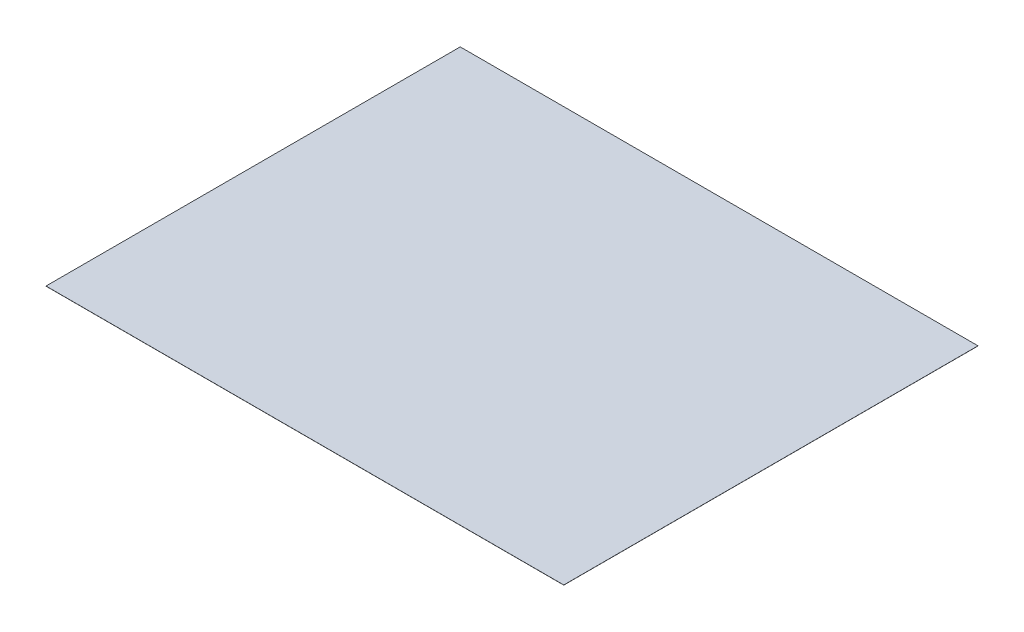
ISO-10303-21;
HEADER;
FILE_DESCRIPTION(('STEP AP214'),'2;1');
FILE_NAME('part.step','',(''),(''),'','','');
FILE_SCHEMA(('AUTOMOTIVE_DESIGN { 1 0 10303 214 1 1 1 1 }'));
ENDSEC;
DATA;
#1=APPLICATION_CONTEXT('core data for automotive mechanical design processes');
#2=APPLICATION_PROTOCOL_DEFINITION('international standard','automotive_design',2000,#1);
#3=PRODUCT_CONTEXT('',#1,'mechanical');
#4=PRODUCT('Part','Part','',(#3));
#5=PRODUCT_RELATED_PRODUCT_CATEGORY('part','',(#4));
#6=PRODUCT_DEFINITION_FORMATION('','',#4);
#7=PRODUCT_DEFINITION_CONTEXT('part definition',#1,'design');
#8=PRODUCT_DEFINITION('design','',#6,#7);
#9=PRODUCT_DEFINITION_SHAPE('','',#8);
#10=(LENGTH_UNIT() NAMED_UNIT(*) SI_UNIT(.MILLI.,.METRE.));
#11=(NAMED_UNIT(*) PLANE_ANGLE_UNIT() SI_UNIT($,.RADIAN.));
#12=(NAMED_UNIT(*) SI_UNIT($,.STERADIAN.) SOLID_ANGLE_UNIT());
#13=UNCERTAINTY_MEASURE_WITH_UNIT(LENGTH_MEASURE(1.E-05),#10,'distance_accuracy_value','');
#14=(GEOMETRIC_REPRESENTATION_CONTEXT(3) GLOBAL_UNCERTAINTY_ASSIGNED_CONTEXT((#13)) GLOBAL_UNIT_ASSIGNED_CONTEXT((#10,
#11,#12)) REPRESENTATION_CONTEXT('',''));
#15=CARTESIAN_POINT('',(0.,0.,0.));
#16=DIRECTION('',(0.,0.,1.));
#17=DIRECTION('',(1.,0.,0.));
#18=AXIS2_PLACEMENT_3D('',#15,#16,#17);
#19=CARTESIAN_POINT('',(3048.,1.5875,2438.4));
#20=DIRECTION('',(-1.,0.,0.));
#21=DIRECTION('',(0.,0.,1.));
#22=AXIS2_PLACEMENT_3D('',#19,#20,#21);
#23=PLANE('',#22);
#24=DIRECTION('',(0.,0.,-1.));
#25=VECTOR('',#24,1.);
#26=CARTESIAN_POINT('',(3048.,0.,2438.4));
#27=LINE('',#26,#25);
#28=CARTESIAN_POINT('',(3048.,0.,2438.4));
#29=VERTEX_POINT('',#28);
#30=CARTESIAN_POINT('',(3048.,0.,-2438.4));
#31=VERTEX_POINT('',#30);
#32=EDGE_CURVE('E102',#29,#31,#27,.T.);
#33=ORIENTED_EDGE('',*,*,#32,.T.);
#34=DIRECTION('',(0.,-1.,0.));
#35=VECTOR('',#34,1.);
#36=CARTESIAN_POINT('',(3048.,1.5875,-2438.4));
#37=LINE('',#36,#35);
#38=CARTESIAN_POINT('',(3048.,1.5875,-2438.4));
#39=VERTEX_POINT('',#38);
#40=EDGE_CURVE('E11',#39,#31,#37,.T.);
#41=ORIENTED_EDGE('',*,*,#40,.F.);
#42=DIRECTION('',(0.,0.,-1.));
#43=VECTOR('',#42,1.);
#44=CARTESIAN_POINT('',(3048.,1.5875,2438.4));
#45=LINE('',#44,#43);
#46=CARTESIAN_POINT('',(3048.,1.5875,2438.4));
#47=VERTEX_POINT('',#46);
#48=EDGE_CURVE('E90',#47,#39,#45,.T.);
#49=ORIENTED_EDGE('',*,*,#48,.F.);
#50=DIRECTION('',(0.,-1.,0.));
#51=VECTOR('',#50,1.);
#52=CARTESIAN_POINT('',(3048.,1.5875,2438.4));
#53=LINE('',#52,#51);
#54=EDGE_CURVE('E98',#47,#29,#53,.T.);
#55=ORIENTED_EDGE('',*,*,#54,.T.);
#56=EDGE_LOOP('',(#33,#41,#49,#55));
#57=FACE_BOUND('',#56,.T.);
#58=ADVANCED_FACE('F39',(#57),#23,.F.);
#59=CARTESIAN_POINT('',(-3048.,1.5875,-2438.4));
#60=DIRECTION('',(0.,0.,1.));
#61=DIRECTION('',(1.,0.,0.));
#62=AXIS2_PLACEMENT_3D('',#59,#60,#61);
#63=PLANE('',#62);
#64=DIRECTION('',(-1.,0.,0.));
#65=VECTOR('',#64,1.);
#66=CARTESIAN_POINT('',(-3048.,0.,-2438.4));
#67=LINE('',#66,#65);
#68=CARTESIAN_POINT('',(-3048.,0.,-2438.4));
#69=VERTEX_POINT('',#68);
#70=EDGE_CURVE('E94',#31,#69,#67,.T.);
#71=ORIENTED_EDGE('',*,*,#70,.T.);
#72=DIRECTION('',(0.,-1.,0.));
#73=VECTOR('',#72,1.);
#74=CARTESIAN_POINT('',(-3048.,1.5875,-2438.4));
#75=LINE('',#74,#73);
#76=CARTESIAN_POINT('',(-3048.,1.5875,-2438.4));
#77=VERTEX_POINT('',#76);
#78=EDGE_CURVE('E47',#77,#69,#75,.T.);
#79=ORIENTED_EDGE('',*,*,#78,.F.);
#80=DIRECTION('',(-1.,0.,0.));
#81=VECTOR('',#80,1.);
#82=CARTESIAN_POINT('',(-3048.,1.5875,-2438.4));
#83=LINE('',#82,#81);
#84=EDGE_CURVE('E85',#39,#77,#83,.T.);
#85=ORIENTED_EDGE('',*,*,#84,.F.);
#86=ORIENTED_EDGE('',*,*,#40,.T.);
#87=EDGE_LOOP('',(#71,#79,#85,#86));
#88=FACE_BOUND('',#87,.T.);
#89=ADVANCED_FACE('F93',(#88),#63,.F.);
#90=CARTESIAN_POINT('',(-3048.,1.5875,2438.4));
#91=DIRECTION('',(1.,0.,0.));
#92=DIRECTION('',(0.,0.,-1.));
#93=AXIS2_PLACEMENT_3D('',#90,#91,#92);
#94=PLANE('',#93);
#95=DIRECTION('',(0.,0.,1.));
#96=VECTOR('',#95,1.);
#97=CARTESIAN_POINT('',(-3048.,0.,2438.4));
#98=LINE('',#97,#96);
#99=CARTESIAN_POINT('',(-3048.,0.,2438.4));
#100=VERTEX_POINT('',#99);
#101=EDGE_CURVE('E72',#69,#100,#98,.T.);
#102=ORIENTED_EDGE('',*,*,#101,.T.);
#103=DIRECTION('',(0.,-1.,0.));
#104=VECTOR('',#103,1.);
#105=CARTESIAN_POINT('',(-3048.,1.5875,2438.4));
#106=LINE('',#105,#104);
#107=CARTESIAN_POINT('',(-3048.,1.5875,2438.4));
#108=VERTEX_POINT('',#107);
#109=EDGE_CURVE('E95',#108,#100,#106,.T.);
#110=ORIENTED_EDGE('',*,*,#109,.F.);
#111=DIRECTION('',(0.,0.,1.));
#112=VECTOR('',#111,1.);
#113=CARTESIAN_POINT('',(-3048.,1.5875,2438.4));
#114=LINE('',#113,#112);
#115=EDGE_CURVE('E88',#77,#108,#114,.T.);
#116=ORIENTED_EDGE('',*,*,#115,.F.);
#117=ORIENTED_EDGE('',*,*,#78,.T.);
#118=EDGE_LOOP('',(#102,#110,#116,#117));
#119=FACE_BOUND('',#118,.T.);
#120=ADVANCED_FACE('F96',(#119),#94,.F.);
#121=CARTESIAN_POINT('',(-3048.,1.5875,2438.4));
#122=DIRECTION('',(0.,0.,-1.));
#123=DIRECTION('',(-1.,0.,0.));
#124=AXIS2_PLACEMENT_3D('',#121,#122,#123);
#125=PLANE('',#124);
#126=DIRECTION('',(1.,0.,0.));
#127=VECTOR('',#126,1.);
#128=CARTESIAN_POINT('',(-3048.,0.,2438.4));
#129=LINE('',#128,#127);
#130=EDGE_CURVE('E78',#100,#29,#129,.T.);
#131=ORIENTED_EDGE('',*,*,#130,.T.);
#132=ORIENTED_EDGE('',*,*,#54,.F.);
#133=DIRECTION('',(1.,0.,0.));
#134=VECTOR('',#133,1.);
#135=CARTESIAN_POINT('',(-3048.,1.5875,2438.4));
#136=LINE('',#135,#134);
#137=EDGE_CURVE('E55',#108,#47,#136,.T.);
#138=ORIENTED_EDGE('',*,*,#137,.F.);
#139=ORIENTED_EDGE('',*,*,#109,.T.);
#140=EDGE_LOOP('',(#131,#132,#138,#139));
#141=FACE_BOUND('',#140,.T.);
#142=ADVANCED_FACE('F109',(#141),#125,.F.);
#143=CARTESIAN_POINT('',(0.,1.5875,0.));
#144=DIRECTION('',(0.,-1.,0.));
#145=DIRECTION('',(0.,0.,-1.));
#146=AXIS2_PLACEMENT_3D('',#143,#144,#145);
#147=PLANE('',#146);
#148=ORIENTED_EDGE('',*,*,#48,.T.);
#149=ORIENTED_EDGE('',*,*,#84,.T.);
#150=ORIENTED_EDGE('',*,*,#115,.T.);
#151=ORIENTED_EDGE('',*,*,#137,.T.);
#152=EDGE_LOOP('',(#148,#149,#150,#151));
#153=FACE_BOUND('',#152,.T.);
#154=ADVANCED_FACE('F86',(#153),#147,.F.);
#155=CARTESIAN_POINT('',(0.,0.,0.));
#156=DIRECTION('',(0.,-1.,0.));
#157=DIRECTION('',(0.,0.,-1.));
#158=AXIS2_PLACEMENT_3D('',#155,#156,#157);
#159=PLANE('',#158);
#160=ORIENTED_EDGE('',*,*,#32,.F.);
#161=ORIENTED_EDGE('',*,*,#130,.F.);
#162=ORIENTED_EDGE('',*,*,#101,.F.);
#163=ORIENTED_EDGE('',*,*,#70,.F.);
#164=EDGE_LOOP('',(#160,#161,#162,#163));
#165=FACE_BOUND('',#164,.T.);
#166=ADVANCED_FACE('F112',(#165),#159,.T.);
#167=CLOSED_SHELL('',(#58,#89,#120,#142,#154,#166));
#168=MANIFOLD_SOLID_BREP('B2',#167);
#169=ADVANCED_BREP_SHAPE_REPRESENTATION('',(#18,#168),#14);
#170=SHAPE_DEFINITION_REPRESENTATION(#9,#169);
ENDSEC;
END-ISO-10303-21;
